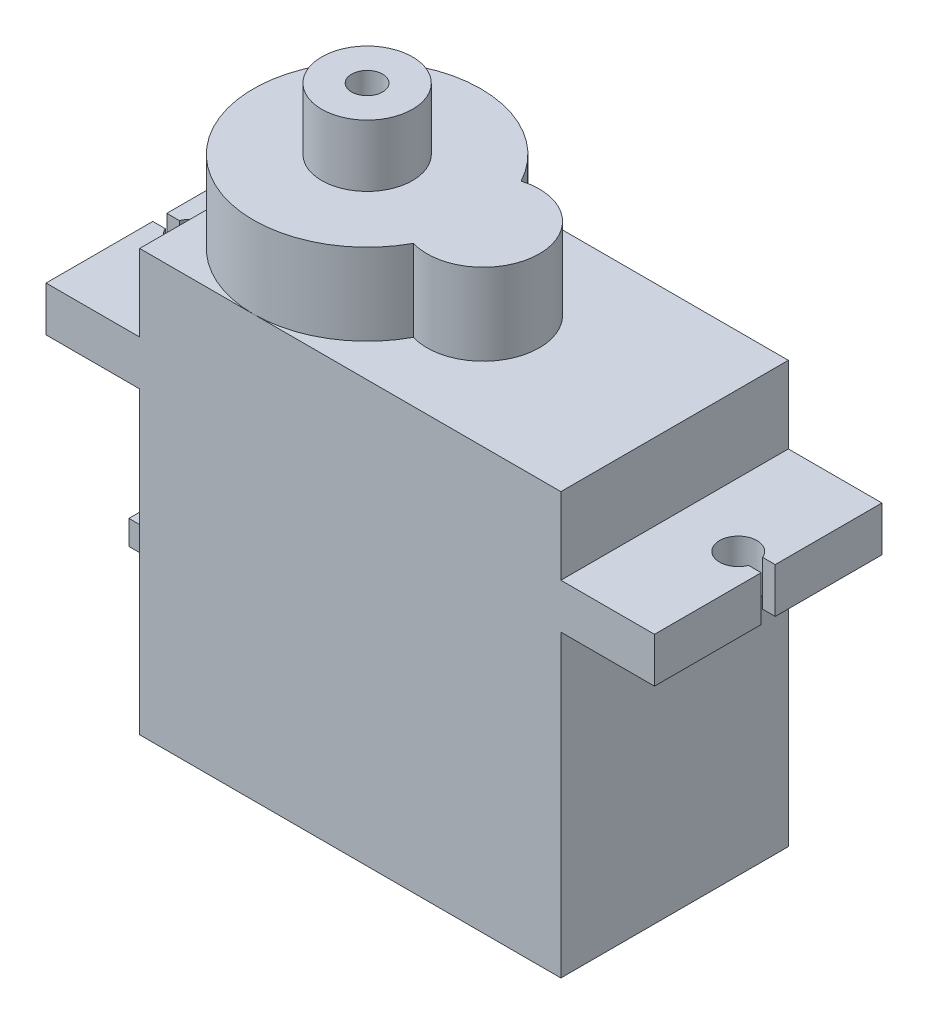
ISO-10303-21;
HEADER;
FILE_DESCRIPTION(('STEP AP214'),'2;1');
FILE_NAME('part.step','',(''),(''),'','','');
FILE_SCHEMA(('AUTOMOTIVE_DESIGN { 1 0 10303 214 1 1 1 1 }'));
ENDSEC;
DATA;
#1=APPLICATION_CONTEXT('core data for automotive mechanical design processes');
#2=APPLICATION_PROTOCOL_DEFINITION('international standard','automotive_design',2000,#1);
#3=PRODUCT_CONTEXT('',#1,'mechanical');
#4=PRODUCT('Part','Part','',(#3));
#5=PRODUCT_RELATED_PRODUCT_CATEGORY('part','',(#4));
#6=PRODUCT_DEFINITION_FORMATION('','',#4);
#7=PRODUCT_DEFINITION_CONTEXT('part definition',#1,'design');
#8=PRODUCT_DEFINITION('design','',#6,#7);
#9=PRODUCT_DEFINITION_SHAPE('','',#8);
#10=(LENGTH_UNIT() NAMED_UNIT(*) SI_UNIT(.MILLI.,.METRE.));
#11=(NAMED_UNIT(*) PLANE_ANGLE_UNIT() SI_UNIT($,.RADIAN.));
#12=(NAMED_UNIT(*) SI_UNIT($,.STERADIAN.) SOLID_ANGLE_UNIT());
#13=UNCERTAINTY_MEASURE_WITH_UNIT(LENGTH_MEASURE(1.E-05),#10,'distance_accuracy_value','');
#14=(GEOMETRIC_REPRESENTATION_CONTEXT(3) GLOBAL_UNCERTAINTY_ASSIGNED_CONTEXT((#13)) GLOBAL_UNIT_ASSIGNED_CONTEXT((#10,
#11,#12)) REPRESENTATION_CONTEXT('',''));
#15=CARTESIAN_POINT('',(0.,0.,0.));
#16=DIRECTION('',(0.,0.,1.));
#17=DIRECTION('',(1.,0.,0.));
#18=AXIS2_PLACEMENT_3D('',#15,#16,#17);
#19=CARTESIAN_POINT('',(-16.25,7.15,12.15));
#20=DIRECTION('',(1.,0.,0.));
#21=DIRECTION('',(0.,0.,-1.));
#22=AXIS2_PLACEMENT_3D('',#19,#20,#21);
#23=PLANE('',#22);
#24=DIRECTION('',(0.,0.,-1.));
#25=VECTOR('',#24,1.);
#26=CARTESIAN_POINT('',(-16.25,4.75,12.15));
#27=LINE('',#26,#25);
#28=CARTESIAN_POINT('',(-16.25,4.75,5.7));
#29=VERTEX_POINT('',#28);
#30=CARTESIAN_POINT('',(-16.25,4.75,0.));
#31=VERTEX_POINT('',#30);
#32=EDGE_CURVE('E410',#29,#31,#27,.T.);
#33=ORIENTED_EDGE('',*,*,#32,.F.);
#34=DIRECTION('',(0.,1.,0.));
#35=VECTOR('',#34,1.);
#36=CARTESIAN_POINT('',(-16.25,7.15,5.7));
#37=LINE('',#36,#35);
#38=CARTESIAN_POINT('',(-16.25,7.15,5.7));
#39=VERTEX_POINT('',#38);
#40=EDGE_CURVE('E275',#29,#39,#37,.T.);
#41=ORIENTED_EDGE('',*,*,#40,.T.);
#42=DIRECTION('',(0.,0.,-1.));
#43=VECTOR('',#42,1.);
#44=CARTESIAN_POINT('',(-16.25,7.15,12.15));
#45=LINE('',#44,#43);
#46=CARTESIAN_POINT('',(-16.25,7.15,0.));
#47=VERTEX_POINT('',#46);
#48=EDGE_CURVE('E414',#39,#47,#45,.T.);
#49=ORIENTED_EDGE('',*,*,#48,.T.);
#50=DIRECTION('',(0.,-1.,0.));
#51=VECTOR('',#50,1.);
#52=CARTESIAN_POINT('',(-16.25,7.15,0.));
#53=LINE('',#52,#51);
#54=EDGE_CURVE('E370',#47,#31,#53,.T.);
#55=ORIENTED_EDGE('',*,*,#54,.T.);
#56=EDGE_LOOP('',(#33,#41,#49,#55));
#57=FACE_BOUND('',#56,.T.);
#58=ADVANCED_FACE('F36',(#57),#23,.F.);
#59=CARTESIAN_POINT('',(16.25,7.15,12.15));
#60=DIRECTION('',(-1.,0.,0.));
#61=DIRECTION('',(0.,0.,1.));
#62=AXIS2_PLACEMENT_3D('',#59,#60,#61);
#63=PLANE('',#62);
#64=DIRECTION('',(0.,0.,-1.));
#65=VECTOR('',#64,1.);
#66=CARTESIAN_POINT('',(16.25,7.15,12.15));
#67=LINE('',#66,#65);
#68=CARTESIAN_POINT('',(16.25,7.14999999999993,5.7));
#69=VERTEX_POINT('',#68);
#70=CARTESIAN_POINT('',(16.25,7.15,0.));
#71=VERTEX_POINT('',#70);
#72=EDGE_CURVE('E390',#69,#71,#67,.T.);
#73=ORIENTED_EDGE('',*,*,#72,.F.);
#74=DIRECTION('',(0.,-1.,0.));
#75=VECTOR('',#74,1.);
#76=CARTESIAN_POINT('',(16.25,7.15,5.7));
#77=LINE('',#76,#75);
#78=CARTESIAN_POINT('',(16.25,4.75,5.7));
#79=VERTEX_POINT('',#78);
#80=EDGE_CURVE('E285',#69,#79,#77,.T.);
#81=ORIENTED_EDGE('',*,*,#80,.T.);
#82=DIRECTION('',(0.,0.,-1.));
#83=VECTOR('',#82,1.);
#84=CARTESIAN_POINT('',(16.25,4.75,12.15));
#85=LINE('',#84,#83);
#86=CARTESIAN_POINT('',(16.25,4.75,0.));
#87=VERTEX_POINT('',#86);
#88=EDGE_CURVE('E394',#79,#87,#85,.T.);
#89=ORIENTED_EDGE('',*,*,#88,.T.);
#90=DIRECTION('',(0.,1.,0.));
#91=VECTOR('',#90,1.);
#92=CARTESIAN_POINT('',(16.25,7.15,0.));
#93=LINE('',#92,#91);
#94=EDGE_CURVE('E384',#87,#71,#93,.T.);
#95=ORIENTED_EDGE('',*,*,#94,.T.);
#96=EDGE_LOOP('',(#73,#81,#89,#95));
#97=FACE_BOUND('',#96,.T.);
#98=ADVANCED_FACE('F449',(#97),#63,.F.);
#99=CARTESIAN_POINT('',(-11.25,11.25,12.15));
#100=DIRECTION('',(0.,-1.,0.));
#101=DIRECTION('',(0.,0.,-1.));
#102=AXIS2_PLACEMENT_3D('',#99,#100,#101);
#103=PLANE('',#102);
#104=CARTESIAN_POINT('',(1.025,11.25,6.075));
#105=DIRECTION('',(0.,1.,0.));
#106=DIRECTION('',(0.,0.,1.));
#107=AXIS2_PLACEMENT_3D('',#104,#105,#106);
#108=CIRCLE('',#107,3.);
#109=CARTESIAN_POINT('',(0.175453629032258,11.25,8.95219845745398));
#110=VERTEX_POINT('',#109);
#111=CARTESIAN_POINT('',(0.175453629032258,11.25,3.19780154254602));
#112=VERTEX_POINT('',#111);
#113=EDGE_CURVE('E308',#110,#112,#108,.T.);
#114=ORIENTED_EDGE('',*,*,#113,.F.);
#115=CARTESIAN_POINT('',(-5.175,11.25,6.075));
#116=DIRECTION('',(0.,1.,0.));
#117=DIRECTION('',(0.,0.,1.));
#118=AXIS2_PLACEMENT_3D('',#115,#116,#117);
#119=CIRCLE('',#118,6.075);
#120=CARTESIAN_POINT('',(-5.175,11.25,12.15));
#121=VERTEX_POINT('',#120);
#122=EDGE_CURVE('E323',#121,#110,#119,.T.);
#123=ORIENTED_EDGE('',*,*,#122,.F.);
#124=DIRECTION('',(-1.,0.,0.));
#125=VECTOR('',#124,1.);
#126=CARTESIAN_POINT('',(-11.25,11.25,12.15));
#127=LINE('',#126,#125);
#128=CARTESIAN_POINT('',(11.25,11.25,12.15));
#129=VERTEX_POINT('',#128);
#130=EDGE_CURVE('E335',#129,#121,#127,.T.);
#131=ORIENTED_EDGE('',*,*,#130,.F.);
#132=DIRECTION('',(0.,0.,-1.));
#133=VECTOR('',#132,1.);
#134=CARTESIAN_POINT('',(11.25,11.25,12.15));
#135=LINE('',#134,#133);
#136=CARTESIAN_POINT('',(11.25,11.25,0.));
#137=VERTEX_POINT('',#136);
#138=EDGE_CURVE('E425',#129,#137,#135,.T.);
#139=ORIENTED_EDGE('',*,*,#138,.T.);
#140=DIRECTION('',(-1.,0.,0.));
#141=VECTOR('',#140,1.);
#142=CARTESIAN_POINT('',(-11.25,11.25,0.));
#143=LINE('',#142,#141);
#144=CARTESIAN_POINT('',(-5.175,11.25,0.));
#145=VERTEX_POINT('',#144);
#146=EDGE_CURVE('E362',#137,#145,#143,.T.);
#147=ORIENTED_EDGE('',*,*,#146,.T.);
#148=EDGE_CURVE('E315',#112,#145,#119,.T.);
#149=ORIENTED_EDGE('',*,*,#148,.F.);
#150=EDGE_LOOP('',(#114,#123,#131,#139,#147,#149));
#151=FACE_BOUND('',#150,.T.);
#152=ADVANCED_FACE('F538',(#151),#103,.F.);
#153=CARTESIAN_POINT('',(-11.25,11.25,6.075));
#154=VERTEX_POINT('',#153);
#155=EDGE_CURVE('E322',#145,#154,#119,.T.);
#156=ORIENTED_EDGE('',*,*,#155,.F.);
#157=CARTESIAN_POINT('',(-11.25,11.25,0.));
#158=VERTEX_POINT('',#157);
#159=EDGE_CURVE('E361',#145,#158,#143,.T.);
#160=ORIENTED_EDGE('',*,*,#159,.T.);
#161=DIRECTION('',(0.,0.,-1.));
#162=VECTOR('',#161,1.);
#163=CARTESIAN_POINT('',(-11.25,11.25,12.15));
#164=LINE('',#163,#162);
#165=EDGE_CURVE('E421',#154,#158,#164,.T.);
#166=ORIENTED_EDGE('',*,*,#165,.F.);
#167=EDGE_LOOP('',(#156,#160,#166));
#168=FACE_BOUND('',#167,.T.);
#169=ADVANCED_FACE('F497',(#168),#103,.F.);
#170=CARTESIAN_POINT('',(11.25,7.15,12.15));
#171=DIRECTION('',(-1.,0.,0.));
#172=DIRECTION('',(0.,0.,1.));
#173=AXIS2_PLACEMENT_3D('',#170,#171,#172);
#174=PLANE('',#173);
#175=DIRECTION('',(0.,1.,0.));
#176=VECTOR('',#175,1.);
#177=CARTESIAN_POINT('',(11.25,7.15,0.));
#178=LINE('',#177,#176);
#179=CARTESIAN_POINT('',(11.25,7.15,0.));
#180=VERTEX_POINT('',#179);
#181=EDGE_CURVE('E329',#180,#137,#178,.T.);
#182=ORIENTED_EDGE('',*,*,#181,.T.);
#183=ORIENTED_EDGE('',*,*,#138,.F.);
#184=DIRECTION('',(0.,1.,0.));
#185=VECTOR('',#184,1.);
#186=CARTESIAN_POINT('',(11.25,7.15,12.15));
#187=LINE('',#186,#185);
#188=CARTESIAN_POINT('',(11.25,7.15,12.15));
#189=VERTEX_POINT('',#188);
#190=EDGE_CURVE('E330',#189,#129,#187,.T.);
#191=ORIENTED_EDGE('',*,*,#190,.F.);
#192=DIRECTION('',(0.,0.,-1.));
#193=VECTOR('',#192,1.);
#194=CARTESIAN_POINT('',(11.25,7.15,12.15));
#195=LINE('',#194,#193);
#196=EDGE_CURVE('E358',#189,#180,#195,.T.);
#197=ORIENTED_EDGE('',*,*,#196,.T.);
#198=EDGE_LOOP('',(#182,#183,#191,#197));
#199=FACE_BOUND('',#198,.T.);
#200=ADVANCED_FACE('F38',(#199),#174,.F.);
#201=EDGE_CURVE('E488',#154,#121,#119,.T.);
#202=ORIENTED_EDGE('',*,*,#201,.F.);
#203=CARTESIAN_POINT('',(-11.25,11.25,12.15));
#204=VERTEX_POINT('',#203);
#205=EDGE_CURVE('E422',#204,#154,#164,.T.);
#206=ORIENTED_EDGE('',*,*,#205,.F.);
#207=EDGE_CURVE('E333',#121,#204,#127,.T.);
#208=ORIENTED_EDGE('',*,*,#207,.F.);
#209=EDGE_LOOP('',(#202,#206,#208));
#210=FACE_BOUND('',#209,.T.);
#211=ADVANCED_FACE('F493',(#210),#103,.F.);
#212=CARTESIAN_POINT('',(-11.25,7.14999999999999,12.15));
#213=DIRECTION('',(1.,0.,0.));
#214=DIRECTION('',(0.,1.,0.));
#215=AXIS2_PLACEMENT_3D('',#212,#213,#214);
#216=PLANE('',#215);
#217=DIRECTION('',(0.,-1.,0.));
#218=VECTOR('',#217,1.);
#219=CARTESIAN_POINT('',(-11.25,7.14999999999999,0.));
#220=LINE('',#219,#218);
#221=CARTESIAN_POINT('',(-11.25,7.14999999999999,0.));
#222=VERTEX_POINT('',#221);
#223=EDGE_CURVE('E365',#158,#222,#220,.T.);
#224=ORIENTED_EDGE('',*,*,#223,.T.);
#225=DIRECTION('',(0.,0.,-1.));
#226=VECTOR('',#225,1.);
#227=CARTESIAN_POINT('',(-11.25,7.14999999999999,12.15));
#228=LINE('',#227,#226);
#229=CARTESIAN_POINT('',(-11.25,7.14999999999999,12.15));
#230=VERTEX_POINT('',#229);
#231=EDGE_CURVE('E418',#230,#222,#228,.T.);
#232=ORIENTED_EDGE('',*,*,#231,.F.);
#233=DIRECTION('',(0.,-1.,0.));
#234=VECTOR('',#233,1.);
#235=CARTESIAN_POINT('',(-11.25,7.14999999999999,12.15));
#236=LINE('',#235,#234);
#237=EDGE_CURVE('E338',#204,#230,#236,.T.);
#238=ORIENTED_EDGE('',*,*,#237,.F.);
#239=ORIENTED_EDGE('',*,*,#205,.T.);
#240=ORIENTED_EDGE('',*,*,#165,.T.);
#241=EDGE_LOOP('',(#224,#232,#238,#239,#240));
#242=FACE_BOUND('',#241,.T.);
#243=ADVANCED_FACE('F500',(#242),#216,.F.);
#244=CARTESIAN_POINT('',(-11.25,7.14999999999999,12.15));
#245=DIRECTION('',(0.,-1.,0.));
#246=DIRECTION('',(1.,0.,0.));
#247=AXIS2_PLACEMENT_3D('',#244,#245,#246);
#248=PLANE('',#247);
#249=ORIENTED_EDGE('',*,*,#48,.F.);
#250=DIRECTION('',(-1.,0.,0.));
#251=VECTOR('',#250,1.);
#252=CARTESIAN_POINT('',(-17.235957291623,7.15,5.7));
#253=LINE('',#252,#251);
#254=CARTESIAN_POINT('',(-15.577024810887,7.15,5.7));
#255=VERTEX_POINT('',#254);
#256=EDGE_CURVE('E261',#255,#39,#253,.T.);
#257=ORIENTED_EDGE('',*,*,#256,.F.);
#258=CARTESIAN_POINT('',(-14.65,7.15,6.075));
#259=DIRECTION('',(0.,1.,0.));
#260=DIRECTION('',(-1.,0.,0.));
#261=AXIS2_PLACEMENT_3D('',#258,#259,#260);
#262=CIRCLE('',#261,1.);
#263=CARTESIAN_POINT('',(-15.577024810887,7.15,6.45));
#264=VERTEX_POINT('',#263);
#265=EDGE_CURVE('E289',#264,#255,#262,.T.);
#266=ORIENTED_EDGE('',*,*,#265,.F.);
#267=DIRECTION('',(1.,0.,0.));
#268=VECTOR('',#267,1.);
#269=CARTESIAN_POINT('',(-17.235957291623,7.15,6.45));
#270=LINE('',#269,#268);
#271=CARTESIAN_POINT('',(-16.25,7.15,6.45));
#272=VERTEX_POINT('',#271);
#273=EDGE_CURVE('E259',#272,#264,#270,.T.);
#274=ORIENTED_EDGE('',*,*,#273,.F.);
#275=CARTESIAN_POINT('',(-16.25,7.15,12.15));
#276=VERTEX_POINT('',#275);
#277=EDGE_CURVE('E415',#276,#272,#45,.T.);
#278=ORIENTED_EDGE('',*,*,#277,.F.);
#279=DIRECTION('',(-1.,0.,0.));
#280=VECTOR('',#279,1.);
#281=CARTESIAN_POINT('',(-11.25,7.14999999999999,12.15));
#282=LINE('',#281,#280);
#283=EDGE_CURVE('E340',#230,#276,#282,.T.);
#284=ORIENTED_EDGE('',*,*,#283,.F.);
#285=ORIENTED_EDGE('',*,*,#231,.T.);
#286=DIRECTION('',(-1.,0.,0.));
#287=VECTOR('',#286,1.);
#288=CARTESIAN_POINT('',(-11.25,7.14999999999999,0.));
#289=LINE('',#288,#287);
#290=EDGE_CURVE('E367',#222,#47,#289,.T.);
#291=ORIENTED_EDGE('',*,*,#290,.T.);
#292=EDGE_LOOP('',(#249,#257,#266,#274,#278,#284,#285,#291));
#293=FACE_BOUND('',#292,.T.);
#294=ADVANCED_FACE('F509',(#293),#248,.F.);
#295=ORIENTED_EDGE('',*,*,#277,.T.);
#296=DIRECTION('',(0.,-1.,0.));
#297=VECTOR('',#296,1.);
#298=CARTESIAN_POINT('',(-16.25,7.15,6.45));
#299=LINE('',#298,#297);
#300=CARTESIAN_POINT('',(-16.25,4.75,6.45));
#301=VERTEX_POINT('',#300);
#302=EDGE_CURVE('E269',#272,#301,#299,.T.);
#303=ORIENTED_EDGE('',*,*,#302,.T.);
#304=CARTESIAN_POINT('',(-16.25,4.75,12.15));
#305=VERTEX_POINT('',#304);
#306=EDGE_CURVE('E411',#305,#301,#27,.T.);
#307=ORIENTED_EDGE('',*,*,#306,.F.);
#308=DIRECTION('',(0.,-1.,0.));
#309=VECTOR('',#308,1.);
#310=CARTESIAN_POINT('',(-16.25,7.15,12.15));
#311=LINE('',#310,#309);
#312=EDGE_CURVE('E342',#276,#305,#311,.T.);
#313=ORIENTED_EDGE('',*,*,#312,.F.);
#314=EDGE_LOOP('',(#295,#303,#307,#313));
#315=FACE_BOUND('',#314,.T.);
#316=ADVANCED_FACE('F512',(#315),#23,.F.);
#317=CARTESIAN_POINT('',(-11.25,4.74999999999999,12.15));
#318=DIRECTION('',(0.,1.,0.));
#319=DIRECTION('',(-1.,0.,0.));
#320=AXIS2_PLACEMENT_3D('',#317,#318,#319);
#321=PLANE('',#320);
#322=CARTESIAN_POINT('',(-14.65,4.75,6.075));
#323=DIRECTION('',(0.,1.,0.));
#324=DIRECTION('',(-1.,0.,0.));
#325=AXIS2_PLACEMENT_3D('',#322,#323,#324);
#326=CIRCLE('',#325,1.);
#327=CARTESIAN_POINT('',(-15.577024810887,4.75,6.45));
#328=VERTEX_POINT('',#327);
#329=CARTESIAN_POINT('',(-15.577024810887,4.75,5.7));
#330=VERTEX_POINT('',#329);
#331=EDGE_CURVE('E297',#328,#330,#326,.T.);
#332=ORIENTED_EDGE('',*,*,#331,.T.);
#333=DIRECTION('',(-1.,0.,0.));
#334=VECTOR('',#333,1.);
#335=CARTESIAN_POINT('',(-11.25,4.74999999999999,5.7));
#336=LINE('',#335,#334);
#337=EDGE_CURVE('E272',#330,#29,#336,.T.);
#338=ORIENTED_EDGE('',*,*,#337,.T.);
#339=ORIENTED_EDGE('',*,*,#32,.T.);
#340=DIRECTION('',(1.,0.,0.));
#341=VECTOR('',#340,1.);
#342=CARTESIAN_POINT('',(-11.25,4.74999999999999,0.));
#343=LINE('',#342,#341);
#344=CARTESIAN_POINT('',(-11.25,4.74999999999999,0.));
#345=VERTEX_POINT('',#344);
#346=EDGE_CURVE('E373',#31,#345,#343,.T.);
#347=ORIENTED_EDGE('',*,*,#346,.T.);
#348=DIRECTION('',(0.,0.,-1.));
#349=VECTOR('',#348,1.);
#350=CARTESIAN_POINT('',(-11.25,4.74999999999999,12.15));
#351=LINE('',#350,#349);
#352=CARTESIAN_POINT('',(-11.25,4.74999999999999,12.15));
#353=VERTEX_POINT('',#352);
#354=EDGE_CURVE('E407',#353,#345,#351,.T.);
#355=ORIENTED_EDGE('',*,*,#354,.F.);
#356=DIRECTION('',(1.,0.,0.));
#357=VECTOR('',#356,1.);
#358=CARTESIAN_POINT('',(-11.25,4.74999999999999,12.15));
#359=LINE('',#358,#357);
#360=EDGE_CURVE('E344',#305,#353,#359,.T.);
#361=ORIENTED_EDGE('',*,*,#360,.F.);
#362=ORIENTED_EDGE('',*,*,#306,.T.);
#363=DIRECTION('',(1.,0.,0.));
#364=VECTOR('',#363,1.);
#365=CARTESIAN_POINT('',(-11.25,4.74999999999999,6.45));
#366=LINE('',#365,#364);
#367=EDGE_CURVE('E264',#301,#328,#366,.T.);
#368=ORIENTED_EDGE('',*,*,#367,.T.);
#369=EDGE_LOOP('',(#332,#338,#339,#347,#355,#361,#362,#368));
#370=FACE_BOUND('',#369,.T.);
#371=ADVANCED_FACE('F516',(#370),#321,.F.);
#372=CARTESIAN_POINT('',(-11.25,-11.25,12.15));
#373=DIRECTION('',(1.,0.,0.));
#374=DIRECTION('',(0.,1.,0.));
#375=AXIS2_PLACEMENT_3D('',#372,#373,#374);
#376=PLANE('',#375);
#377=DIRECTION('',(0.,0.,1.));
#378=VECTOR('',#377,1.);
#379=CARTESIAN_POINT('',(-11.25,-5.95,12.15));
#380=LINE('',#379,#378);
#381=CARTESIAN_POINT('',(-11.25,-5.95,4.425));
#382=VERTEX_POINT('',#381);
#383=CARTESIAN_POINT('',(-11.25,-5.95,7.725));
#384=VERTEX_POINT('',#383);
#385=EDGE_CURVE('E253',#382,#384,#380,.T.);
#386=ORIENTED_EDGE('',*,*,#385,.T.);
#387=DIRECTION('',(0.,-1.,0.));
#388=VECTOR('',#387,1.);
#389=CARTESIAN_POINT('',(-11.25,-11.25,7.725));
#390=LINE('',#389,#388);
#391=CARTESIAN_POINT('',(-11.25,-7.25,7.725));
#392=VERTEX_POINT('',#391);
#393=EDGE_CURVE('E256',#384,#392,#390,.T.);
#394=ORIENTED_EDGE('',*,*,#393,.T.);
#395=DIRECTION('',(0.,0.,-1.));
#396=VECTOR('',#395,1.);
#397=CARTESIAN_POINT('',(-11.25,-7.25,12.15));
#398=LINE('',#397,#396);
#399=CARTESIAN_POINT('',(-11.25,-7.25,4.425));
#400=VERTEX_POINT('',#399);
#401=EDGE_CURVE('E221',#392,#400,#398,.T.);
#402=ORIENTED_EDGE('',*,*,#401,.T.);
#403=DIRECTION('',(0.,1.,0.));
#404=VECTOR('',#403,1.);
#405=CARTESIAN_POINT('',(-11.25,-11.25,4.425));
#406=LINE('',#405,#404);
#407=EDGE_CURVE('E250',#400,#382,#406,.T.);
#408=ORIENTED_EDGE('',*,*,#407,.T.);
#409=EDGE_LOOP('',(#386,#394,#402,#408));
#410=FACE_BOUND('',#409,.T.);
#411=DIRECTION('',(0.,-1.,0.));
#412=VECTOR('',#411,1.);
#413=CARTESIAN_POINT('',(-11.25,-11.25,0.));
#414=LINE('',#413,#412);
#415=CARTESIAN_POINT('',(-11.25,-11.25,0.));
#416=VERTEX_POINT('',#415);
#417=EDGE_CURVE('E375',#345,#416,#414,.T.);
#418=ORIENTED_EDGE('',*,*,#417,.T.);
#419=DIRECTION('',(0.,0.,-1.));
#420=VECTOR('',#419,1.);
#421=CARTESIAN_POINT('',(-11.25,-11.25,12.15));
#422=LINE('',#421,#420);
#423=CARTESIAN_POINT('',(-11.25,-11.25,12.15));
#424=VERTEX_POINT('',#423);
#425=EDGE_CURVE('E404',#424,#416,#422,.T.);
#426=ORIENTED_EDGE('',*,*,#425,.F.);
#427=DIRECTION('',(0.,-1.,0.));
#428=VECTOR('',#427,1.);
#429=CARTESIAN_POINT('',(-11.25,-11.25,12.15));
#430=LINE('',#429,#428);
#431=EDGE_CURVE('E346',#353,#424,#430,.T.);
#432=ORIENTED_EDGE('',*,*,#431,.F.);
#433=ORIENTED_EDGE('',*,*,#354,.T.);
#434=EDGE_LOOP('',(#418,#426,#432,#433));
#435=FACE_BOUND('',#434,.T.);
#436=ADVANCED_FACE('F520',(#410,#435),#376,.F.);
#437=CARTESIAN_POINT('',(-11.25,-11.25,12.15));
#438=DIRECTION('',(0.,1.,0.));
#439=DIRECTION('',(0.,0.,1.));
#440=AXIS2_PLACEMENT_3D('',#437,#438,#439);
#441=PLANE('',#440);
#442=DIRECTION('',(1.,0.,0.));
#443=VECTOR('',#442,1.);
#444=CARTESIAN_POINT('',(-11.25,-11.25,0.));
#445=LINE('',#444,#443);
#446=CARTESIAN_POINT('',(11.25,-11.25,0.));
#447=VERTEX_POINT('',#446);
#448=EDGE_CURVE('E377',#416,#447,#445,.T.);
#449=ORIENTED_EDGE('',*,*,#448,.T.);
#450=DIRECTION('',(0.,0.,-1.));
#451=VECTOR('',#450,1.);
#452=CARTESIAN_POINT('',(11.25,-11.25,12.15));
#453=LINE('',#452,#451);
#454=CARTESIAN_POINT('',(11.25,-11.25,12.15));
#455=VERTEX_POINT('',#454);
#456=EDGE_CURVE('E401',#455,#447,#453,.T.);
#457=ORIENTED_EDGE('',*,*,#456,.F.);
#458=DIRECTION('',(1.,0.,0.));
#459=VECTOR('',#458,1.);
#460=CARTESIAN_POINT('',(-11.25,-11.25,12.15));
#461=LINE('',#460,#459);
#462=EDGE_CURVE('E348',#424,#455,#461,.T.);
#463=ORIENTED_EDGE('',*,*,#462,.F.);
#464=ORIENTED_EDGE('',*,*,#425,.T.);
#465=EDGE_LOOP('',(#449,#457,#463,#464));
#466=FACE_BOUND('',#465,.T.);
#467=ADVANCED_FACE('F522',(#466),#441,.F.);
#468=CARTESIAN_POINT('',(11.25,-11.25,12.15));
#469=DIRECTION('',(-1.,0.,0.));
#470=DIRECTION('',(0.,0.,1.));
#471=AXIS2_PLACEMENT_3D('',#468,#469,#470);
#472=PLANE('',#471);
#473=DIRECTION('',(0.,1.,0.));
#474=VECTOR('',#473,1.);
#475=CARTESIAN_POINT('',(11.25,-11.25,0.));
#476=LINE('',#475,#474);
#477=CARTESIAN_POINT('',(11.25,4.75,0.));
#478=VERTEX_POINT('',#477);
#479=EDGE_CURVE('E379',#447,#478,#476,.T.);
#480=ORIENTED_EDGE('',*,*,#479,.T.);
#481=DIRECTION('',(0.,0.,-1.));
#482=VECTOR('',#481,1.);
#483=CARTESIAN_POINT('',(11.25,4.75,12.15));
#484=LINE('',#483,#482);
#485=CARTESIAN_POINT('',(11.25,4.75,12.15));
#486=VERTEX_POINT('',#485);
#487=EDGE_CURVE('E398',#486,#478,#484,.T.);
#488=ORIENTED_EDGE('',*,*,#487,.F.);
#489=DIRECTION('',(0.,1.,0.));
#490=VECTOR('',#489,1.);
#491=CARTESIAN_POINT('',(11.25,-11.25,12.15));
#492=LINE('',#491,#490);
#493=EDGE_CURVE('E350',#455,#486,#492,.T.);
#494=ORIENTED_EDGE('',*,*,#493,.F.);
#495=ORIENTED_EDGE('',*,*,#456,.T.);
#496=EDGE_LOOP('',(#480,#488,#494,#495));
#497=FACE_BOUND('',#496,.T.);
#498=ADVANCED_FACE('F470',(#497),#472,.F.);
#499=CARTESIAN_POINT('',(11.25,4.75,12.15));
#500=DIRECTION('',(0.,1.,0.));
#501=DIRECTION('',(0.,0.,1.));
#502=AXIS2_PLACEMENT_3D('',#499,#500,#501);
#503=PLANE('',#502);
#504=ORIENTED_EDGE('',*,*,#88,.F.);
#505=DIRECTION('',(-1.,0.,0.));
#506=VECTOR('',#505,1.);
#507=CARTESIAN_POINT('',(11.25,4.75,5.7));
#508=LINE('',#507,#506);
#509=CARTESIAN_POINT('',(15.5770248108869,4.75,5.7));
#510=VERTEX_POINT('',#509);
#511=EDGE_CURVE('E282',#79,#510,#508,.T.);
#512=ORIENTED_EDGE('',*,*,#511,.T.);
#513=CARTESIAN_POINT('',(14.65,4.75,6.075));
#514=DIRECTION('',(0.,1.,0.));
#515=DIRECTION('',(0.,0.,1.));
#516=AXIS2_PLACEMENT_3D('',#513,#514,#515);
#517=CIRCLE('',#516,1.);
#518=CARTESIAN_POINT('',(15.5770248108869,4.75,6.45));
#519=VERTEX_POINT('',#518);
#520=EDGE_CURVE('E292',#510,#519,#517,.T.);
#521=ORIENTED_EDGE('',*,*,#520,.T.);
#522=DIRECTION('',(1.,0.,0.));
#523=VECTOR('',#522,1.);
#524=CARTESIAN_POINT('',(11.25,4.75,6.45));
#525=LINE('',#524,#523);
#526=CARTESIAN_POINT('',(16.25,4.75,6.45));
#527=VERTEX_POINT('',#526);
#528=EDGE_CURVE('E59',#519,#527,#525,.T.);
#529=ORIENTED_EDGE('',*,*,#528,.T.);
#530=CARTESIAN_POINT('',(16.25,4.75,12.15));
#531=VERTEX_POINT('',#530);
#532=EDGE_CURVE('E395',#531,#527,#85,.T.);
#533=ORIENTED_EDGE('',*,*,#532,.F.);
#534=DIRECTION('',(1.,0.,0.));
#535=VECTOR('',#534,1.);
#536=CARTESIAN_POINT('',(11.25,4.75,12.15));
#537=LINE('',#536,#535);
#538=EDGE_CURVE('E352',#486,#531,#537,.T.);
#539=ORIENTED_EDGE('',*,*,#538,.F.);
#540=ORIENTED_EDGE('',*,*,#487,.T.);
#541=DIRECTION('',(1.,0.,0.));
#542=VECTOR('',#541,1.);
#543=CARTESIAN_POINT('',(11.25,4.75,0.));
#544=LINE('',#543,#542);
#545=EDGE_CURVE('E381',#478,#87,#544,.T.);
#546=ORIENTED_EDGE('',*,*,#545,.T.);
#547=EDGE_LOOP('',(#504,#512,#521,#529,#533,#539,#540,#546));
#548=FACE_BOUND('',#547,.T.);
#549=ADVANCED_FACE('F442',(#548),#503,.F.);
#550=ORIENTED_EDGE('',*,*,#532,.T.);
#551=DIRECTION('',(0.,1.,0.));
#552=VECTOR('',#551,1.);
#553=CARTESIAN_POINT('',(16.25,7.15,6.45));
#554=LINE('',#553,#552);
#555=CARTESIAN_POINT('',(16.25,7.14999999999993,6.45));
#556=VERTEX_POINT('',#555);
#557=EDGE_CURVE('E279',#527,#556,#554,.T.);
#558=ORIENTED_EDGE('',*,*,#557,.T.);
#559=CARTESIAN_POINT('',(16.25,7.15,12.15));
#560=VERTEX_POINT('',#559);
#561=EDGE_CURVE('E391',#560,#556,#67,.T.);
#562=ORIENTED_EDGE('',*,*,#561,.F.);
#563=DIRECTION('',(0.,1.,0.));
#564=VECTOR('',#563,1.);
#565=CARTESIAN_POINT('',(16.25,7.15,12.15));
#566=LINE('',#565,#564);
#567=EDGE_CURVE('E354',#531,#560,#566,.T.);
#568=ORIENTED_EDGE('',*,*,#567,.F.);
#569=EDGE_LOOP('',(#550,#558,#562,#568));
#570=FACE_BOUND('',#569,.T.);
#571=ADVANCED_FACE('F459',(#570),#63,.F.);
#572=CARTESIAN_POINT('',(11.25,7.15,12.15));
#573=DIRECTION('',(0.,-1.,0.));
#574=DIRECTION('',(1.,0.,0.));
#575=AXIS2_PLACEMENT_3D('',#572,#573,#574);
#576=PLANE('',#575);
#577=CARTESIAN_POINT('',(14.65,7.14999999999993,6.075));
#578=DIRECTION('',(0.,1.,0.));
#579=DIRECTION('',(-1.,0.,0.));
#580=AXIS2_PLACEMENT_3D('',#577,#578,#579);
#581=CIRCLE('',#580,1.);
#582=CARTESIAN_POINT('',(15.577024810887,7.14999999999993,5.7));
#583=VERTEX_POINT('',#582);
#584=CARTESIAN_POINT('',(15.577024810887,7.14999999999993,6.45));
#585=VERTEX_POINT('',#584);
#586=EDGE_CURVE('E288',#583,#585,#581,.T.);
#587=ORIENTED_EDGE('',*,*,#586,.F.);
#588=DIRECTION('',(-1.,0.,0.));
#589=VECTOR('',#588,1.);
#590=CARTESIAN_POINT('',(15.1718030846879,7.14999999999993,5.7));
#591=LINE('',#590,#589);
#592=EDGE_CURVE('E262',#69,#583,#591,.T.);
#593=ORIENTED_EDGE('',*,*,#592,.F.);
#594=ORIENTED_EDGE('',*,*,#72,.T.);
#595=DIRECTION('',(-1.,0.,0.));
#596=VECTOR('',#595,1.);
#597=CARTESIAN_POINT('',(11.25,7.15,0.));
#598=LINE('',#597,#596);
#599=EDGE_CURVE('E334',#71,#180,#598,.T.);
#600=ORIENTED_EDGE('',*,*,#599,.T.);
#601=ORIENTED_EDGE('',*,*,#196,.F.);
#602=DIRECTION('',(-1.,0.,0.));
#603=VECTOR('',#602,1.);
#604=CARTESIAN_POINT('',(11.25,7.15,12.15));
#605=LINE('',#604,#603);
#606=EDGE_CURVE('E356',#560,#189,#605,.T.);
#607=ORIENTED_EDGE('',*,*,#606,.F.);
#608=ORIENTED_EDGE('',*,*,#561,.T.);
#609=DIRECTION('',(1.,0.,0.));
#610=VECTOR('',#609,1.);
#611=CARTESIAN_POINT('',(15.1718030846879,7.14999999999993,6.45));
#612=LINE('',#611,#610);
#613=EDGE_CURVE('E258',#585,#556,#612,.T.);
#614=ORIENTED_EDGE('',*,*,#613,.F.);
#615=EDGE_LOOP('',(#587,#593,#594,#600,#601,#607,#608,#614));
#616=FACE_BOUND('',#615,.T.);
#617=ADVANCED_FACE('F453',(#616),#576,.F.);
#618=CARTESIAN_POINT('',(0.,0.,12.15));
#619=DIRECTION('',(0.,0.,-1.));
#620=DIRECTION('',(-1.,0.,0.));
#621=AXIS2_PLACEMENT_3D('',#618,#619,#620);
#622=PLANE('',#621);
#623=ORIENTED_EDGE('',*,*,#190,.T.);
#624=ORIENTED_EDGE('',*,*,#130,.T.);
#625=ORIENTED_EDGE('',*,*,#207,.T.);
#626=ORIENTED_EDGE('',*,*,#237,.T.);
#627=ORIENTED_EDGE('',*,*,#283,.T.);
#628=ORIENTED_EDGE('',*,*,#312,.T.);
#629=ORIENTED_EDGE('',*,*,#360,.T.);
#630=ORIENTED_EDGE('',*,*,#431,.T.);
#631=ORIENTED_EDGE('',*,*,#462,.T.);
#632=ORIENTED_EDGE('',*,*,#493,.T.);
#633=ORIENTED_EDGE('',*,*,#538,.T.);
#634=ORIENTED_EDGE('',*,*,#567,.T.);
#635=ORIENTED_EDGE('',*,*,#606,.T.);
#636=EDGE_LOOP('',(#623,#624,#625,#626,#627,#628,#629,#630,#631,#632,#633,#634,#635));
#637=FACE_BOUND('',#636,.T.);
#638=ADVANCED_FACE('F465',(#637),#622,.F.);
#639=CARTESIAN_POINT('',(0.,0.,0.));
#640=DIRECTION('',(0.,0.,-1.));
#641=DIRECTION('',(-1.,0.,0.));
#642=AXIS2_PLACEMENT_3D('',#639,#640,#641);
#643=PLANE('',#642);
#644=ORIENTED_EDGE('',*,*,#181,.F.);
#645=ORIENTED_EDGE('',*,*,#599,.F.);
#646=ORIENTED_EDGE('',*,*,#94,.F.);
#647=ORIENTED_EDGE('',*,*,#545,.F.);
#648=ORIENTED_EDGE('',*,*,#479,.F.);
#649=ORIENTED_EDGE('',*,*,#448,.F.);
#650=ORIENTED_EDGE('',*,*,#417,.F.);
#651=ORIENTED_EDGE('',*,*,#346,.F.);
#652=ORIENTED_EDGE('',*,*,#54,.F.);
#653=ORIENTED_EDGE('',*,*,#290,.F.);
#654=ORIENTED_EDGE('',*,*,#223,.F.);
#655=ORIENTED_EDGE('',*,*,#159,.F.);
#656=ORIENTED_EDGE('',*,*,#146,.F.);
#657=EDGE_LOOP('',(#644,#645,#646,#647,#648,#649,#650,#651,#652,#653,#654,#655,#656));
#658=FACE_BOUND('',#657,.T.);
#659=ADVANCED_FACE('F475',(#658),#643,.T.);
#660=CARTESIAN_POINT('',(1.025,15.6,6.075));
#661=DIRECTION('',(0.,-1.,0.));
#662=DIRECTION('',(0.,0.,-1.));
#663=AXIS2_PLACEMENT_3D('',#660,#661,#662);
#664=CYLINDRICAL_SURFACE('',#663,3.);
#665=ORIENTED_EDGE('',*,*,#113,.T.);
#666=DIRECTION('',(0.,-1.,0.));
#667=VECTOR('',#666,1.);
#668=CARTESIAN_POINT('',(0.175453629032258,15.6,3.19780154254602));
#669=LINE('',#668,#667);
#670=CARTESIAN_POINT('',(0.175453629032258,15.6,3.19780154254602));
#671=VERTEX_POINT('',#670);
#672=EDGE_CURVE('E326',#671,#112,#669,.T.);
#673=ORIENTED_EDGE('',*,*,#672,.F.);
#674=CARTESIAN_POINT('',(1.025,15.6,6.075));
#675=DIRECTION('',(0.,1.,0.));
#676=DIRECTION('',(0.,0.,1.));
#677=AXIS2_PLACEMENT_3D('',#674,#675,#676);
#678=CIRCLE('',#677,3.);
#679=CARTESIAN_POINT('',(0.175453629032258,15.6,8.95219845745398));
#680=VERTEX_POINT('',#679);
#681=EDGE_CURVE('E311',#680,#671,#678,.T.);
#682=ORIENTED_EDGE('',*,*,#681,.F.);
#683=DIRECTION('',(0.,-1.,0.));
#684=VECTOR('',#683,1.);
#685=CARTESIAN_POINT('',(0.175453629032258,15.6,8.95219845745398));
#686=LINE('',#685,#684);
#687=EDGE_CURVE('E317',#680,#110,#686,.T.);
#688=ORIENTED_EDGE('',*,*,#687,.T.);
#689=EDGE_LOOP('',(#665,#673,#682,#688));
#690=FACE_BOUND('',#689,.T.);
#691=ADVANCED_FACE('F585',(#690),#664,.T.);
#692=CARTESIAN_POINT('',(-5.175,15.6,6.075));
#693=DIRECTION('',(0.,-1.,0.));
#694=DIRECTION('',(0.,0.,-1.));
#695=AXIS2_PLACEMENT_3D('',#692,#693,#694);
#696=CYLINDRICAL_SURFACE('',#695,6.075);
#697=ORIENTED_EDGE('',*,*,#148,.T.);
#698=ORIENTED_EDGE('',*,*,#155,.T.);
#699=ORIENTED_EDGE('',*,*,#201,.T.);
#700=ORIENTED_EDGE('',*,*,#122,.T.);
#701=ORIENTED_EDGE('',*,*,#687,.F.);
#702=CARTESIAN_POINT('',(-5.175,15.6,6.075));
#703=DIRECTION('',(0.,1.,0.));
#704=DIRECTION('',(0.,0.,1.));
#705=AXIS2_PLACEMENT_3D('',#702,#703,#704);
#706=CIRCLE('',#705,6.075);
#707=EDGE_CURVE('E314',#671,#680,#706,.T.);
#708=ORIENTED_EDGE('',*,*,#707,.F.);
#709=ORIENTED_EDGE('',*,*,#672,.T.);
#710=EDGE_LOOP('',(#697,#698,#699,#700,#701,#708,#709));
#711=FACE_BOUND('',#710,.T.);
#712=ADVANCED_FACE('F489',(#711),#696,.T.);
#713=CARTESIAN_POINT('',(-2.075,15.6,6.075));
#714=DIRECTION('',(0.,1.,0.));
#715=DIRECTION('',(0.,0.,1.));
#716=AXIS2_PLACEMENT_3D('',#713,#714,#715);
#717=PLANE('',#716);
#718=CARTESIAN_POINT('',(-5.175,15.6,6.075));
#719=DIRECTION('',(0.,1.,0.));
#720=DIRECTION('',(0.,0.,1.));
#721=AXIS2_PLACEMENT_3D('',#718,#719,#720);
#722=CIRCLE('',#721,2.425);
#723=CARTESIAN_POINT('',(-5.175,15.6,8.5));
#724=VERTEX_POINT('',#723);
#725=EDGE_CURVE('E301',#724,#724,#722,.T.);
#726=ORIENTED_EDGE('',*,*,#725,.F.);
#727=EDGE_LOOP('',(#726));
#728=FACE_BOUND('',#727,.T.);
#729=ORIENTED_EDGE('',*,*,#681,.T.);
#730=ORIENTED_EDGE('',*,*,#707,.T.);
#731=EDGE_LOOP('',(#729,#730));
#732=FACE_BOUND('',#731,.T.);
#733=ADVANCED_FACE('F600',(#728,#732),#717,.T.);
#734=CARTESIAN_POINT('',(-5.175,18.9,6.075));
#735=DIRECTION('',(0.,-1.,0.));
#736=DIRECTION('',(0.,0.,-1.));
#737=AXIS2_PLACEMENT_3D('',#734,#735,#736);
#738=CYLINDRICAL_SURFACE('',#737,2.425);
#739=CARTESIAN_POINT('',(-5.175,18.9,6.075));
#740=DIRECTION('',(0.,1.,0.));
#741=DIRECTION('',(0.,0.,1.));
#742=AXIS2_PLACEMENT_3D('',#739,#740,#741);
#743=CIRCLE('',#742,2.425);
#744=CARTESIAN_POINT('',(-5.175,18.9,8.5));
#745=VERTEX_POINT('',#744);
#746=EDGE_CURVE('E305',#745,#745,#743,.T.);
#747=ORIENTED_EDGE('',*,*,#746,.F.);
#748=EDGE_LOOP('',(#747));
#749=FACE_BOUND('',#748,.T.);
#750=ORIENTED_EDGE('',*,*,#725,.T.);
#751=EDGE_LOOP('',(#750));
#752=FACE_BOUND('',#751,.T.);
#753=ADVANCED_FACE('F608',(#749,#752),#738,.T.);
#754=CARTESIAN_POINT('',(-5.175,18.9,6.075));
#755=DIRECTION('',(0.,1.,0.));
#756=DIRECTION('',(0.,0.,1.));
#757=AXIS2_PLACEMENT_3D('',#754,#755,#756);
#758=PLANE('',#757);
#759=CARTESIAN_POINT('',(-5.175,18.9,6.075));
#760=DIRECTION('',(0.,1.,0.));
#761=DIRECTION('',(0.,0.,1.));
#762=AXIS2_PLACEMENT_3D('',#759,#760,#761);
#763=CIRCLE('',#762,0.828221188526252);
#764=CARTESIAN_POINT('',(-5.175,18.9,6.90322118852625));
#765=VERTEX_POINT('',#764);
#766=EDGE_CURVE('E302',#765,#765,#763,.T.);
#767=ORIENTED_EDGE('',*,*,#766,.F.);
#768=EDGE_LOOP('',(#767));
#769=FACE_BOUND('',#768,.T.);
#770=ORIENTED_EDGE('',*,*,#746,.T.);
#771=EDGE_LOOP('',(#770));
#772=FACE_BOUND('',#771,.T.);
#773=ADVANCED_FACE('F617',(#769,#772),#758,.T.);
#774=CARTESIAN_POINT('',(-5.175,14.9,6.075));
#775=DIRECTION('',(0.,1.,0.));
#776=DIRECTION('',(0.,0.,1.));
#777=AXIS2_PLACEMENT_3D('',#774,#775,#776);
#778=CYLINDRICAL_SURFACE('',#777,0.828221188526252);
#779=CARTESIAN_POINT('',(-5.175,14.9,6.075));
#780=DIRECTION('',(0.,1.,0.));
#781=DIRECTION('',(0.,0.,1.));
#782=AXIS2_PLACEMENT_3D('',#779,#780,#781);
#783=CIRCLE('',#782,0.828221188526252);
#784=CARTESIAN_POINT('',(-5.175,14.9,6.90322118852625));
#785=VERTEX_POINT('',#784);
#786=EDGE_CURVE('E298',#785,#785,#783,.T.);
#787=ORIENTED_EDGE('',*,*,#786,.F.);
#788=EDGE_LOOP('',(#787));
#789=FACE_BOUND('',#788,.T.);
#790=ORIENTED_EDGE('',*,*,#766,.T.);
#791=EDGE_LOOP('',(#790));
#792=FACE_BOUND('',#791,.T.);
#793=ADVANCED_FACE('F626',(#789,#792),#778,.F.);
#794=CARTESIAN_POINT('',(-5.175,14.9,6.075));
#795=DIRECTION('',(0.,1.,0.));
#796=DIRECTION('',(0.,0.,1.));
#797=AXIS2_PLACEMENT_3D('',#794,#795,#796);
#798=PLANE('',#797);
#799=ORIENTED_EDGE('',*,*,#786,.T.);
#800=EDGE_LOOP('',(#799));
#801=FACE_BOUND('',#800,.T.);
#802=ADVANCED_FACE('F635',(#801),#798,.T.);
#803=CARTESIAN_POINT('',(14.65,2.14999999999993,6.075));
#804=DIRECTION('',(0.,1.,0.));
#805=DIRECTION('',(-1.,0.,0.));
#806=AXIS2_PLACEMENT_3D('',#803,#804,#805);
#807=CYLINDRICAL_SURFACE('',#806,1.);
#808=ORIENTED_EDGE('',*,*,#520,.F.);
#809=DIRECTION('',(0.,1.,0.));
#810=VECTOR('',#809,1.);
#811=CARTESIAN_POINT('',(15.5770248108869,2.14999999999993,5.7));
#812=LINE('',#811,#810);
#813=EDGE_CURVE('E11',#510,#583,#812,.T.);
#814=ORIENTED_EDGE('',*,*,#813,.T.);
#815=ORIENTED_EDGE('',*,*,#586,.T.);
#816=DIRECTION('',(0.,1.,0.));
#817=VECTOR('',#816,1.);
#818=CARTESIAN_POINT('',(15.5770248108869,2.14999999999993,6.45));
#819=LINE('',#818,#817);
#820=EDGE_CURVE('E44',#585,#519,#819,.F.);
#821=ORIENTED_EDGE('',*,*,#820,.T.);
#822=EDGE_LOOP('',(#808,#814,#815,#821));
#823=FACE_BOUND('',#822,.T.);
#824=ADVANCED_FACE('F437',(#823),#807,.F.);
#825=CARTESIAN_POINT('',(-14.65,2.15,6.075));
#826=DIRECTION('',(0.,1.,0.));
#827=DIRECTION('',(-1.,0.,0.));
#828=AXIS2_PLACEMENT_3D('',#825,#826,#827);
#829=CYLINDRICAL_SURFACE('',#828,1.);
#830=ORIENTED_EDGE('',*,*,#265,.T.);
#831=DIRECTION('',(0.,1.,0.));
#832=VECTOR('',#831,1.);
#833=CARTESIAN_POINT('',(-15.577024810887,2.15,5.7));
#834=LINE('',#833,#832);
#835=EDGE_CURVE('E433',#255,#330,#834,.F.);
#836=ORIENTED_EDGE('',*,*,#835,.T.);
#837=ORIENTED_EDGE('',*,*,#331,.F.);
#838=DIRECTION('',(0.,1.,0.));
#839=VECTOR('',#838,1.);
#840=CARTESIAN_POINT('',(-15.577024810887,2.15,6.45));
#841=LINE('',#840,#839);
#842=EDGE_CURVE('E430',#328,#264,#841,.T.);
#843=ORIENTED_EDGE('',*,*,#842,.T.);
#844=EDGE_LOOP('',(#830,#836,#837,#843));
#845=FACE_BOUND('',#844,.T.);
#846=ADVANCED_FACE('F652',(#845),#829,.F.);
#847=CARTESIAN_POINT('',(-17.235957291623,2.15,6.45));
#848=DIRECTION('',(0.,0.,1.));
#849=DIRECTION('',(1.,0.,0.));
#850=AXIS2_PLACEMENT_3D('',#847,#848,#849);
#851=PLANE('',#850);
#852=ORIENTED_EDGE('',*,*,#273,.T.);
#853=ORIENTED_EDGE('',*,*,#842,.F.);
#854=ORIENTED_EDGE('',*,*,#367,.F.);
#855=ORIENTED_EDGE('',*,*,#302,.F.);
#856=EDGE_LOOP('',(#852,#853,#854,#855));
#857=FACE_BOUND('',#856,.T.);
#858=ADVANCED_FACE('F661',(#857),#851,.F.);
#859=CARTESIAN_POINT('',(-17.235957291623,2.15,5.7));
#860=DIRECTION('',(0.,0.,-1.));
#861=DIRECTION('',(-1.,0.,0.));
#862=AXIS2_PLACEMENT_3D('',#859,#860,#861);
#863=PLANE('',#862);
#864=ORIENTED_EDGE('',*,*,#337,.F.);
#865=ORIENTED_EDGE('',*,*,#835,.F.);
#866=ORIENTED_EDGE('',*,*,#256,.T.);
#867=ORIENTED_EDGE('',*,*,#40,.F.);
#868=EDGE_LOOP('',(#864,#865,#866,#867));
#869=FACE_BOUND('',#868,.T.);
#870=ADVANCED_FACE('F679',(#869),#863,.F.);
#871=CARTESIAN_POINT('',(15.1718030846879,2.14999999999993,6.45));
#872=DIRECTION('',(0.,0.,1.));
#873=DIRECTION('',(1.,0.,0.));
#874=AXIS2_PLACEMENT_3D('',#871,#872,#873);
#875=PLANE('',#874);
#876=ORIENTED_EDGE('',*,*,#528,.F.);
#877=ORIENTED_EDGE('',*,*,#820,.F.);
#878=ORIENTED_EDGE('',*,*,#613,.T.);
#879=ORIENTED_EDGE('',*,*,#557,.F.);
#880=EDGE_LOOP('',(#876,#877,#878,#879));
#881=FACE_BOUND('',#880,.T.);
#882=ADVANCED_FACE('F457',(#881),#875,.F.);
#883=CARTESIAN_POINT('',(15.1718030846879,2.14999999999993,5.7));
#884=DIRECTION('',(0.,0.,-1.));
#885=DIRECTION('',(-1.,0.,0.));
#886=AXIS2_PLACEMENT_3D('',#883,#884,#885);
#887=PLANE('',#886);
#888=ORIENTED_EDGE('',*,*,#592,.T.);
#889=ORIENTED_EDGE('',*,*,#813,.F.);
#890=ORIENTED_EDGE('',*,*,#511,.F.);
#891=ORIENTED_EDGE('',*,*,#80,.F.);
#892=EDGE_LOOP('',(#888,#889,#890,#891));
#893=FACE_BOUND('',#892,.T.);
#894=ADVANCED_FACE('F445',(#893),#887,.F.);
#895=CARTESIAN_POINT('',(-16.25,-5.95,7.725));
#896=DIRECTION('',(0.,0.,1.));
#897=DIRECTION('',(1.,0.,0.));
#898=AXIS2_PLACEMENT_3D('',#895,#896,#897);
#899=PLANE('',#898);
#900=ORIENTED_EDGE('',*,*,#393,.F.);
#901=DIRECTION('',(1.,0.,0.));
#902=VECTOR('',#901,1.);
#903=CARTESIAN_POINT('',(-16.25,-5.95,7.725));
#904=LINE('',#903,#902);
#905=CARTESIAN_POINT('',(-16.25,-5.95,7.725));
#906=VERTEX_POINT('',#905);
#907=EDGE_CURVE('E239',#906,#384,#904,.T.);
#908=ORIENTED_EDGE('',*,*,#907,.F.);
#909=DIRECTION('',(0.,-1.,0.));
#910=VECTOR('',#909,1.);
#911=CARTESIAN_POINT('',(-16.25,-5.95,7.725));
#912=LINE('',#911,#910);
#913=CARTESIAN_POINT('',(-16.25,-7.25,7.725));
#914=VERTEX_POINT('',#913);
#915=EDGE_CURVE('E232',#906,#914,#912,.T.);
#916=ORIENTED_EDGE('',*,*,#915,.T.);
#917=DIRECTION('',(1.,0.,0.));
#918=VECTOR('',#917,1.);
#919=CARTESIAN_POINT('',(-16.25,-7.25,7.725));
#920=LINE('',#919,#918);
#921=EDGE_CURVE('E216',#914,#392,#920,.T.);
#922=ORIENTED_EDGE('',*,*,#921,.T.);
#923=EDGE_LOOP('',(#900,#908,#916,#922));
#924=FACE_BOUND('',#923,.T.);
#925=ADVANCED_FACE('F237',(#924),#899,.T.);
#926=CARTESIAN_POINT('',(-16.25,-5.95,7.725));
#927=DIRECTION('',(0.,1.,0.));
#928=DIRECTION('',(0.,0.,1.));
#929=AXIS2_PLACEMENT_3D('',#926,#927,#928);
#930=PLANE('',#929);
#931=ORIENTED_EDGE('',*,*,#385,.F.);
#932=DIRECTION('',(1.,0.,0.));
#933=VECTOR('',#932,1.);
#934=CARTESIAN_POINT('',(-16.25,-5.95,4.425));
#935=LINE('',#934,#933);
#936=CARTESIAN_POINT('',(-16.25,-5.95,4.425));
#937=VERTEX_POINT('',#936);
#938=EDGE_CURVE('E245',#937,#382,#935,.T.);
#939=ORIENTED_EDGE('',*,*,#938,.F.);
#940=DIRECTION('',(0.,0.,1.));
#941=VECTOR('',#940,1.);
#942=CARTESIAN_POINT('',(-16.25,-5.95,7.725));
#943=LINE('',#942,#941);
#944=EDGE_CURVE('E225',#937,#906,#943,.T.);
#945=ORIENTED_EDGE('',*,*,#944,.T.);
#946=ORIENTED_EDGE('',*,*,#907,.T.);
#947=EDGE_LOOP('',(#931,#939,#945,#946));
#948=FACE_BOUND('',#947,.T.);
#949=ADVANCED_FACE('F711',(#948),#930,.T.);
#950=CARTESIAN_POINT('',(-16.25,-5.95,4.425));
#951=DIRECTION('',(0.,0.,-1.));
#952=DIRECTION('',(-1.,0.,0.));
#953=AXIS2_PLACEMENT_3D('',#950,#951,#952);
#954=PLANE('',#953);
#955=ORIENTED_EDGE('',*,*,#407,.F.);
#956=DIRECTION('',(1.,0.,0.));
#957=VECTOR('',#956,1.);
#958=CARTESIAN_POINT('',(-16.25,-7.25,4.425));
#959=LINE('',#958,#957);
#960=CARTESIAN_POINT('',(-16.25,-7.25,4.425));
#961=VERTEX_POINT('',#960);
#962=EDGE_CURVE('E51',#961,#400,#959,.T.);
#963=ORIENTED_EDGE('',*,*,#962,.F.);
#964=DIRECTION('',(0.,1.,0.));
#965=VECTOR('',#964,1.);
#966=CARTESIAN_POINT('',(-16.25,-5.95,4.425));
#967=LINE('',#966,#965);
#968=EDGE_CURVE('E235',#961,#937,#967,.T.);
#969=ORIENTED_EDGE('',*,*,#968,.T.);
#970=ORIENTED_EDGE('',*,*,#938,.T.);
#971=EDGE_LOOP('',(#955,#963,#969,#970));
#972=FACE_BOUND('',#971,.T.);
#973=ADVANCED_FACE('F720',(#972),#954,.T.);
#974=CARTESIAN_POINT('',(-16.25,-7.25,7.725));
#975=DIRECTION('',(0.,-1.,0.));
#976=DIRECTION('',(0.,0.,-1.));
#977=AXIS2_PLACEMENT_3D('',#974,#975,#976);
#978=PLANE('',#977);
#979=ORIENTED_EDGE('',*,*,#401,.F.);
#980=ORIENTED_EDGE('',*,*,#921,.F.);
#981=DIRECTION('',(0.,0.,-1.));
#982=VECTOR('',#981,1.);
#983=CARTESIAN_POINT('',(-16.25,-7.25,7.725));
#984=LINE('',#983,#982);
#985=EDGE_CURVE('E219',#914,#961,#984,.T.);
#986=ORIENTED_EDGE('',*,*,#985,.T.);
#987=ORIENTED_EDGE('',*,*,#962,.T.);
#988=EDGE_LOOP('',(#979,#980,#986,#987));
#989=FACE_BOUND('',#988,.T.);
#990=ADVANCED_FACE('F218',(#989),#978,.T.);
#991=CARTESIAN_POINT('',(-16.25,0.,0.));
#992=DIRECTION('',(1.,0.,0.));
#993=DIRECTION('',(0.,0.,-1.));
#994=AXIS2_PLACEMENT_3D('',#991,#992,#993);
#995=PLANE('',#994);
#996=ORIENTED_EDGE('',*,*,#915,.F.);
#997=ORIENTED_EDGE('',*,*,#944,.F.);
#998=ORIENTED_EDGE('',*,*,#968,.F.);
#999=ORIENTED_EDGE('',*,*,#985,.F.);
#1000=EDGE_LOOP('',(#996,#997,#998,#999));
#1001=FACE_BOUND('',#1000,.T.);
#1002=ADVANCED_FACE('F230',(#1001),#995,.F.);
#1003=CLOSED_SHELL('',(#58,#98,#152,#169,#200,#211,#243,#294,#316,#371,#436,#467,#498,#549,#571,
#617,#638,#659,#691,#712,#733,#753,#773,#793,#802,#824,#846,#858,#870,#882,#894,#925,#949,#973,
#990,#1002));
#1004=MANIFOLD_SOLID_BREP('B2',#1003);
#1005=ADVANCED_BREP_SHAPE_REPRESENTATION('',(#18,#1004),#14);
#1006=SHAPE_DEFINITION_REPRESENTATION(#9,#1005);
ENDSEC;
END-ISO-10303-21;
